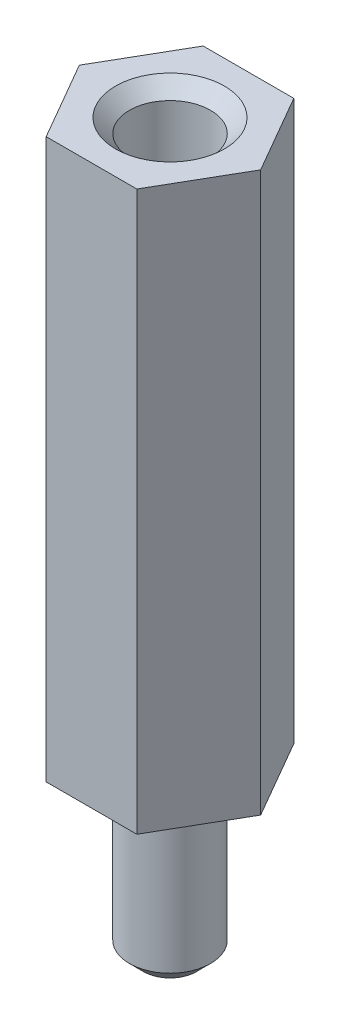
ISO-10303-21;
HEADER;
FILE_DESCRIPTION(('STEP AP214'),'2;1');
FILE_NAME('part.step','',(''),(''),'','','');
FILE_SCHEMA(('AUTOMOTIVE_DESIGN { 1 0 10303 214 1 1 1 1 }'));
ENDSEC;
DATA;
#1=APPLICATION_CONTEXT('core data for automotive mechanical design processes');
#2=APPLICATION_PROTOCOL_DEFINITION('international standard','automotive_design',2000,#1);
#3=PRODUCT_CONTEXT('',#1,'mechanical');
#4=PRODUCT('Part','Part','',(#3));
#5=PRODUCT_RELATED_PRODUCT_CATEGORY('part','',(#4));
#6=PRODUCT_DEFINITION_FORMATION('','',#4);
#7=PRODUCT_DEFINITION_CONTEXT('part definition',#1,'design');
#8=PRODUCT_DEFINITION('design','',#6,#7);
#9=PRODUCT_DEFINITION_SHAPE('','',#8);
#10=(LENGTH_UNIT() NAMED_UNIT(*) SI_UNIT(.MILLI.,.METRE.));
#11=(NAMED_UNIT(*) PLANE_ANGLE_UNIT() SI_UNIT($,.RADIAN.));
#12=(NAMED_UNIT(*) SI_UNIT($,.STERADIAN.) SOLID_ANGLE_UNIT());
#13=UNCERTAINTY_MEASURE_WITH_UNIT(LENGTH_MEASURE(1.E-05),#10,'distance_accuracy_value','');
#14=(GEOMETRIC_REPRESENTATION_CONTEXT(3) GLOBAL_UNCERTAINTY_ASSIGNED_CONTEXT((#13)) GLOBAL_UNIT_ASSIGNED_CONTEXT((#10,
#11,#12)) REPRESENTATION_CONTEXT('',''));
#15=CARTESIAN_POINT('',(0.,0.,0.));
#16=DIRECTION('',(0.,0.,1.));
#17=DIRECTION('',(1.,0.,0.));
#18=AXIS2_PLACEMENT_3D('',#15,#16,#17);
#19=CARTESIAN_POINT('',(1.62235425642285,20.,2.81));
#20=DIRECTION('',(-0.866025403784439,0.,-0.5));
#21=DIRECTION('',(-0.5,0.,0.866025403784439));
#22=AXIS2_PLACEMENT_3D('',#19,#20,#21);
#23=PLANE('',#22);
#24=DIRECTION('',(0.5,0.,-0.866025403784438));
#25=VECTOR('',#24,1.);
#26=CARTESIAN_POINT('',(1.62235425642285,0.,2.81));
#27=LINE('',#26,#25);
#28=CARTESIAN_POINT('',(1.62235425642285,0.,2.81));
#29=VERTEX_POINT('',#28);
#30=CARTESIAN_POINT('',(3.2447085128457,0.,0.));
#31=VERTEX_POINT('',#30);
#32=EDGE_CURVE('E119',#29,#31,#27,.T.);
#33=ORIENTED_EDGE('',*,*,#32,.T.);
#34=DIRECTION('',(0.,-1.,0.));
#35=VECTOR('',#34,1.);
#36=CARTESIAN_POINT('',(3.2447085128457,20.,0.));
#37=LINE('',#36,#35);
#38=CARTESIAN_POINT('',(3.2447085128457,20.,0.));
#39=VERTEX_POINT('',#38);
#40=EDGE_CURVE('E137',#39,#31,#37,.T.);
#41=ORIENTED_EDGE('',*,*,#40,.F.);
#42=DIRECTION('',(0.5,0.,-0.866025403784438));
#43=VECTOR('',#42,1.);
#44=CARTESIAN_POINT('',(1.62235425642285,20.,2.81));
#45=LINE('',#44,#43);
#46=CARTESIAN_POINT('',(1.62235425642285,20.,2.81));
#47=VERTEX_POINT('',#46);
#48=EDGE_CURVE('E130',#47,#39,#45,.T.);
#49=ORIENTED_EDGE('',*,*,#48,.F.);
#50=DIRECTION('',(0.,-1.,0.));
#51=VECTOR('',#50,1.);
#52=CARTESIAN_POINT('',(1.62235425642285,20.,2.81));
#53=LINE('',#52,#51);
#54=EDGE_CURVE('E115',#47,#29,#53,.T.);
#55=ORIENTED_EDGE('',*,*,#54,.T.);
#56=EDGE_LOOP('',(#33,#41,#49,#55));
#57=FACE_BOUND('',#56,.T.);
#58=ADVANCED_FACE('F33',(#57),#23,.F.);
#59=CARTESIAN_POINT('',(3.2447085128457,20.,0.));
#60=DIRECTION('',(-0.866025403784439,0.,0.5));
#61=DIRECTION('',(0.5,0.,0.866025403784439));
#62=AXIS2_PLACEMENT_3D('',#59,#60,#61);
#63=PLANE('',#62);
#64=DIRECTION('',(-0.5,0.,-0.866025403784438));
#65=VECTOR('',#64,1.);
#66=CARTESIAN_POINT('',(3.2447085128457,0.,0.));
#67=LINE('',#66,#65);
#68=CARTESIAN_POINT('',(1.62235425642285,0.,-2.81));
#69=VERTEX_POINT('',#68);
#70=EDGE_CURVE('E122',#31,#69,#67,.T.);
#71=ORIENTED_EDGE('',*,*,#70,.T.);
#72=DIRECTION('',(0.,-1.,0.));
#73=VECTOR('',#72,1.);
#74=CARTESIAN_POINT('',(1.62235425642285,20.,-2.81));
#75=LINE('',#74,#73);
#76=CARTESIAN_POINT('',(1.62235425642285,20.,-2.81));
#77=VERTEX_POINT('',#76);
#78=EDGE_CURVE('E134',#77,#69,#75,.T.);
#79=ORIENTED_EDGE('',*,*,#78,.F.);
#80=DIRECTION('',(-0.5,0.,-0.866025403784438));
#81=VECTOR('',#80,1.);
#82=CARTESIAN_POINT('',(3.2447085128457,20.,0.));
#83=LINE('',#82,#81);
#84=EDGE_CURVE('E88',#39,#77,#83,.T.);
#85=ORIENTED_EDGE('',*,*,#84,.F.);
#86=ORIENTED_EDGE('',*,*,#40,.T.);
#87=EDGE_LOOP('',(#71,#79,#85,#86));
#88=FACE_BOUND('',#87,.T.);
#89=ADVANCED_FACE('F160',(#88),#63,.F.);
#90=CARTESIAN_POINT('',(1.62235425642285,20.,-2.81));
#91=DIRECTION('',(0.,0.,1.));
#92=DIRECTION('',(1.,0.,0.));
#93=AXIS2_PLACEMENT_3D('',#90,#91,#92);
#94=PLANE('',#93);
#95=DIRECTION('',(-1.,0.,0.));
#96=VECTOR('',#95,1.);
#97=CARTESIAN_POINT('',(1.62235425642285,0.,-2.81));
#98=LINE('',#97,#96);
#99=CARTESIAN_POINT('',(-1.62235425642285,0.,-2.81));
#100=VERTEX_POINT('',#99);
#101=EDGE_CURVE('E125',#69,#100,#98,.T.);
#102=ORIENTED_EDGE('',*,*,#101,.T.);
#103=DIRECTION('',(0.,-1.,0.));
#104=VECTOR('',#103,1.);
#105=CARTESIAN_POINT('',(-1.62235425642285,20.,-2.81));
#106=LINE('',#105,#104);
#107=CARTESIAN_POINT('',(-1.62235425642285,20.,-2.81));
#108=VERTEX_POINT('',#107);
#109=EDGE_CURVE('E110',#108,#100,#106,.T.);
#110=ORIENTED_EDGE('',*,*,#109,.F.);
#111=DIRECTION('',(-1.,0.,0.));
#112=VECTOR('',#111,1.);
#113=CARTESIAN_POINT('',(1.62235425642285,20.,-2.81));
#114=LINE('',#113,#112);
#115=EDGE_CURVE('E101',#77,#108,#114,.T.);
#116=ORIENTED_EDGE('',*,*,#115,.F.);
#117=ORIENTED_EDGE('',*,*,#78,.T.);
#118=EDGE_LOOP('',(#102,#110,#116,#117));
#119=FACE_BOUND('',#118,.T.);
#120=ADVANCED_FACE('F166',(#119),#94,.F.);
#121=CARTESIAN_POINT('',(-1.62235425642285,20.,-2.81));
#122=DIRECTION('',(0.866025403784438,0.,0.5));
#123=DIRECTION('',(0.5,0.,-0.866025403784439));
#124=AXIS2_PLACEMENT_3D('',#121,#122,#123);
#125=PLANE('',#124);
#126=DIRECTION('',(-0.5,0.,0.866025403784439));
#127=VECTOR('',#126,1.);
#128=CARTESIAN_POINT('',(-1.62235425642285,0.,-2.81));
#129=LINE('',#128,#127);
#130=CARTESIAN_POINT('',(-3.2447085128457,0.,0.));
#131=VERTEX_POINT('',#130);
#132=EDGE_CURVE('E109',#100,#131,#129,.T.);
#133=ORIENTED_EDGE('',*,*,#132,.T.);
#134=DIRECTION('',(0.,-1.,0.));
#135=VECTOR('',#134,1.);
#136=CARTESIAN_POINT('',(-3.2447085128457,20.,0.));
#137=LINE('',#136,#135);
#138=CARTESIAN_POINT('',(-3.2447085128457,20.,0.));
#139=VERTEX_POINT('',#138);
#140=EDGE_CURVE('E106',#139,#131,#137,.T.);
#141=ORIENTED_EDGE('',*,*,#140,.F.);
#142=DIRECTION('',(-0.5,0.,0.866025403784439));
#143=VECTOR('',#142,1.);
#144=CARTESIAN_POINT('',(-1.62235425642285,20.,-2.81));
#145=LINE('',#144,#143);
#146=EDGE_CURVE('E95',#108,#139,#145,.T.);
#147=ORIENTED_EDGE('',*,*,#146,.F.);
#148=ORIENTED_EDGE('',*,*,#109,.T.);
#149=EDGE_LOOP('',(#133,#141,#147,#148));
#150=FACE_BOUND('',#149,.T.);
#151=ADVANCED_FACE('F107',(#150),#125,.F.);
#152=CARTESIAN_POINT('',(-3.2447085128457,20.,0.));
#153=DIRECTION('',(0.866025403784439,0.,-0.5));
#154=DIRECTION('',(-0.5,0.,-0.866025403784439));
#155=AXIS2_PLACEMENT_3D('',#152,#153,#154);
#156=PLANE('',#155);
#157=DIRECTION('',(0.5,0.,0.866025403784439));
#158=VECTOR('',#157,1.);
#159=CARTESIAN_POINT('',(-3.2447085128457,0.,0.));
#160=LINE('',#159,#158);
#161=CARTESIAN_POINT('',(-1.62235425642285,0.,2.81));
#162=VERTEX_POINT('',#161);
#163=EDGE_CURVE('E73',#131,#162,#160,.T.);
#164=ORIENTED_EDGE('',*,*,#163,.T.);
#165=DIRECTION('',(0.,-1.,0.));
#166=VECTOR('',#165,1.);
#167=CARTESIAN_POINT('',(-1.62235425642285,20.,2.81));
#168=LINE('',#167,#166);
#169=CARTESIAN_POINT('',(-1.62235425642285,20.,2.81));
#170=VERTEX_POINT('',#169);
#171=EDGE_CURVE('E111',#170,#162,#168,.T.);
#172=ORIENTED_EDGE('',*,*,#171,.F.);
#173=DIRECTION('',(0.5,0.,0.866025403784439));
#174=VECTOR('',#173,1.);
#175=CARTESIAN_POINT('',(-3.2447085128457,20.,0.));
#176=LINE('',#175,#174);
#177=EDGE_CURVE('E99',#139,#170,#176,.T.);
#178=ORIENTED_EDGE('',*,*,#177,.F.);
#179=ORIENTED_EDGE('',*,*,#140,.T.);
#180=EDGE_LOOP('',(#164,#172,#178,#179));
#181=FACE_BOUND('',#180,.T.);
#182=ADVANCED_FACE('F113',(#181),#156,.F.);
#183=CARTESIAN_POINT('',(-1.62235425642285,20.,2.81));
#184=DIRECTION('',(0.,0.,-1.));
#185=DIRECTION('',(-1.,0.,0.));
#186=AXIS2_PLACEMENT_3D('',#183,#184,#185);
#187=PLANE('',#186);
#188=DIRECTION('',(1.,0.,0.));
#189=VECTOR('',#188,1.);
#190=CARTESIAN_POINT('',(-1.62235425642285,0.,2.81));
#191=LINE('',#190,#189);
#192=EDGE_CURVE('E79',#162,#29,#191,.T.);
#193=ORIENTED_EDGE('',*,*,#192,.T.);
#194=ORIENTED_EDGE('',*,*,#54,.F.);
#195=DIRECTION('',(1.,0.,0.));
#196=VECTOR('',#195,1.);
#197=CARTESIAN_POINT('',(-1.62235425642285,20.,2.81));
#198=LINE('',#197,#196);
#199=EDGE_CURVE('E50',#170,#47,#198,.T.);
#200=ORIENTED_EDGE('',*,*,#199,.F.);
#201=ORIENTED_EDGE('',*,*,#171,.T.);
#202=EDGE_LOOP('',(#193,#194,#200,#201));
#203=FACE_BOUND('',#202,.T.);
#204=ADVANCED_FACE('F176',(#203),#187,.F.);
#205=CARTESIAN_POINT('',(0.,20.,0.));
#206=DIRECTION('',(0.,1.,0.));
#207=DIRECTION('',(0.,0.,1.));
#208=AXIS2_PLACEMENT_3D('',#205,#206,#207);
#209=PLANE('',#208);
#210=CARTESIAN_POINT('',(0.,20.,0.));
#211=DIRECTION('',(0.,1.,0.));
#212=DIRECTION('',(0.,0.,1.));
#213=AXIS2_PLACEMENT_3D('',#210,#211,#212);
#214=CIRCLE('',#213,1.95);
#215=CARTESIAN_POINT('',(0.,20.,1.95));
#216=VERTEX_POINT('',#215);
#217=EDGE_CURVE('E143',#216,#216,#214,.F.);
#218=ORIENTED_EDGE('',*,*,#217,.T.);
#219=EDGE_LOOP('',(#218));
#220=FACE_BOUND('',#219,.T.);
#221=ORIENTED_EDGE('',*,*,#48,.T.);
#222=ORIENTED_EDGE('',*,*,#84,.T.);
#223=ORIENTED_EDGE('',*,*,#115,.T.);
#224=ORIENTED_EDGE('',*,*,#146,.T.);
#225=ORIENTED_EDGE('',*,*,#177,.T.);
#226=ORIENTED_EDGE('',*,*,#199,.T.);
#227=EDGE_LOOP('',(#221,#222,#223,#224,#225,#226));
#228=FACE_BOUND('',#227,.T.);
#229=ADVANCED_FACE('F97',(#220,#228),#209,.T.);
#230=CARTESIAN_POINT('',(0.,0.,0.));
#231=DIRECTION('',(0.,1.,0.));
#232=DIRECTION('',(0.,0.,1.));
#233=AXIS2_PLACEMENT_3D('',#230,#231,#232);
#234=PLANE('',#233);
#235=CARTESIAN_POINT('',(0.,0.,0.));
#236=DIRECTION('',(0.,-1.,0.));
#237=DIRECTION('',(0.,0.,-1.));
#238=AXIS2_PLACEMENT_3D('',#235,#236,#237);
#239=CIRCLE('',#238,1.45);
#240=CARTESIAN_POINT('',(0.,0.,-1.45));
#241=VERTEX_POINT('',#240);
#242=EDGE_CURVE('E139',#241,#241,#239,.T.);
#243=ORIENTED_EDGE('',*,*,#242,.F.);
#244=EDGE_LOOP('',(#243));
#245=FACE_BOUND('',#244,.T.);
#246=ORIENTED_EDGE('',*,*,#32,.F.);
#247=ORIENTED_EDGE('',*,*,#192,.F.);
#248=ORIENTED_EDGE('',*,*,#163,.F.);
#249=ORIENTED_EDGE('',*,*,#132,.F.);
#250=ORIENTED_EDGE('',*,*,#101,.F.);
#251=ORIENTED_EDGE('',*,*,#70,.F.);
#252=EDGE_LOOP('',(#246,#247,#248,#249,#250,#251));
#253=FACE_BOUND('',#252,.T.);
#254=ADVANCED_FACE('F179',(#245,#253),#234,.F.);
#255=CARTESIAN_POINT('',(0.,-6.,0.));
#256=DIRECTION('',(0.,1.,0.));
#257=DIRECTION('',(0.,0.,1.));
#258=AXIS2_PLACEMENT_3D('',#255,#256,#257);
#259=CYLINDRICAL_SURFACE('',#258,1.45);
#260=CARTESIAN_POINT('',(0.,-5.5,0.));
#261=DIRECTION('',(0.,-1.,0.));
#262=DIRECTION('',(0.,0.,-1.));
#263=AXIS2_PLACEMENT_3D('',#260,#261,#262);
#264=CIRCLE('',#263,1.45);
#265=CARTESIAN_POINT('',(0.,-5.5,-1.45));
#266=VERTEX_POINT('',#265);
#267=EDGE_CURVE('E11',#266,#266,#264,.F.);
#268=ORIENTED_EDGE('',*,*,#267,.T.);
#269=EDGE_LOOP('',(#268));
#270=FACE_BOUND('',#269,.T.);
#271=ORIENTED_EDGE('',*,*,#242,.T.);
#272=EDGE_LOOP('',(#271));
#273=FACE_BOUND('',#272,.T.);
#274=ADVANCED_FACE('F182',(#270,#273),#259,.T.);
#275=CARTESIAN_POINT('',(0.,-6.,0.));
#276=DIRECTION('',(0.,-1.,0.));
#277=DIRECTION('',(0.,0.,-1.));
#278=AXIS2_PLACEMENT_3D('',#275,#276,#277);
#279=PLANE('',#278);
#280=CARTESIAN_POINT('',(0.,-6.,0.));
#281=DIRECTION('',(0.,-1.,0.));
#282=DIRECTION('',(0.,0.,-1.));
#283=AXIS2_PLACEMENT_3D('',#280,#281,#282);
#284=CIRCLE('',#283,0.949999999999996);
#285=CARTESIAN_POINT('',(0.,-6.,-0.949999999999996));
#286=VERTEX_POINT('',#285);
#287=EDGE_CURVE('E42',#286,#286,#284,.T.);
#288=ORIENTED_EDGE('',*,*,#287,.T.);
#289=EDGE_LOOP('',(#288));
#290=FACE_BOUND('',#289,.T.);
#291=ADVANCED_FACE('F148',(#290),#279,.T.);
#292=CARTESIAN_POINT('',(0.,15.,0.));
#293=DIRECTION('',(0.,1.,0.));
#294=DIRECTION('',(0.,0.,1.));
#295=AXIS2_PLACEMENT_3D('',#292,#293,#294);
#296=CYLINDRICAL_SURFACE('',#295,1.45);
#297=CARTESIAN_POINT('',(0.,19.5,0.));
#298=DIRECTION('',(0.,1.,0.));
#299=DIRECTION('',(0.,0.,1.));
#300=AXIS2_PLACEMENT_3D('',#297,#298,#299);
#301=CIRCLE('',#300,1.45);
#302=CARTESIAN_POINT('',(0.,19.5,1.45));
#303=VERTEX_POINT('',#302);
#304=EDGE_CURVE('E140',#303,#303,#301,.T.);
#305=ORIENTED_EDGE('',*,*,#304,.T.);
#306=EDGE_LOOP('',(#305));
#307=FACE_BOUND('',#306,.T.);
#308=CARTESIAN_POINT('',(0.,15.,0.));
#309=DIRECTION('',(0.,1.,0.));
#310=DIRECTION('',(0.,0.,1.));
#311=AXIS2_PLACEMENT_3D('',#308,#309,#310);
#312=CIRCLE('',#311,1.45);
#313=CARTESIAN_POINT('',(0.,15.,1.45));
#314=VERTEX_POINT('',#313);
#315=EDGE_CURVE('E123',#314,#314,#312,.T.);
#316=ORIENTED_EDGE('',*,*,#315,.F.);
#317=EDGE_LOOP('',(#316));
#318=FACE_BOUND('',#317,.T.);
#319=ADVANCED_FACE('F192',(#307,#318),#296,.F.);
#320=CARTESIAN_POINT('',(0.,15.,0.));
#321=DIRECTION('',(0.,1.,0.));
#322=DIRECTION('',(0.,0.,1.));
#323=AXIS2_PLACEMENT_3D('',#320,#321,#322);
#324=PLANE('',#323);
#325=ORIENTED_EDGE('',*,*,#315,.T.);
#326=EDGE_LOOP('',(#325));
#327=FACE_BOUND('',#326,.T.);
#328=ADVANCED_FACE('F156',(#327),#324,.T.);
#329=CARTESIAN_POINT('',(0.,19.5,0.));
#330=DIRECTION('',(0.,1.,0.));
#331=DIRECTION('',(0.,0.,1.));
#332=AXIS2_PLACEMENT_3D('',#329,#330,#331);
#333=CONICAL_SURFACE('',#332,1.45,0.785398163397455);
#334=ORIENTED_EDGE('',*,*,#217,.F.);
#335=EDGE_LOOP('',(#334));
#336=FACE_BOUND('',#335,.T.);
#337=ORIENTED_EDGE('',*,*,#304,.F.);
#338=EDGE_LOOP('',(#337));
#339=FACE_BOUND('',#338,.T.);
#340=ADVANCED_FACE('F151',(#336,#339),#333,.F.);
#341=CARTESIAN_POINT('',(0.,-6.,0.));
#342=DIRECTION('',(0.,1.,0.));
#343=DIRECTION('',(0.,0.,1.));
#344=AXIS2_PLACEMENT_3D('',#341,#342,#343);
#345=CONICAL_SURFACE('',#344,0.949999999999996,0.78539816339745);
#346=ORIENTED_EDGE('',*,*,#267,.F.);
#347=EDGE_LOOP('',(#346));
#348=FACE_BOUND('',#347,.T.);
#349=ORIENTED_EDGE('',*,*,#287,.F.);
#350=EDGE_LOOP('',(#349));
#351=FACE_BOUND('',#350,.T.);
#352=ADVANCED_FACE('F35',(#348,#351),#345,.T.);
#353=CLOSED_SHELL('',(#58,#89,#120,#151,#182,#204,#229,#254,#274,#291,#319,#328,#340,#352));
#354=MANIFOLD_SOLID_BREP('B2',#353);
#355=ADVANCED_BREP_SHAPE_REPRESENTATION('',(#18,#354),#14);
#356=SHAPE_DEFINITION_REPRESENTATION(#9,#355);
ENDSEC;
END-ISO-10303-21;
